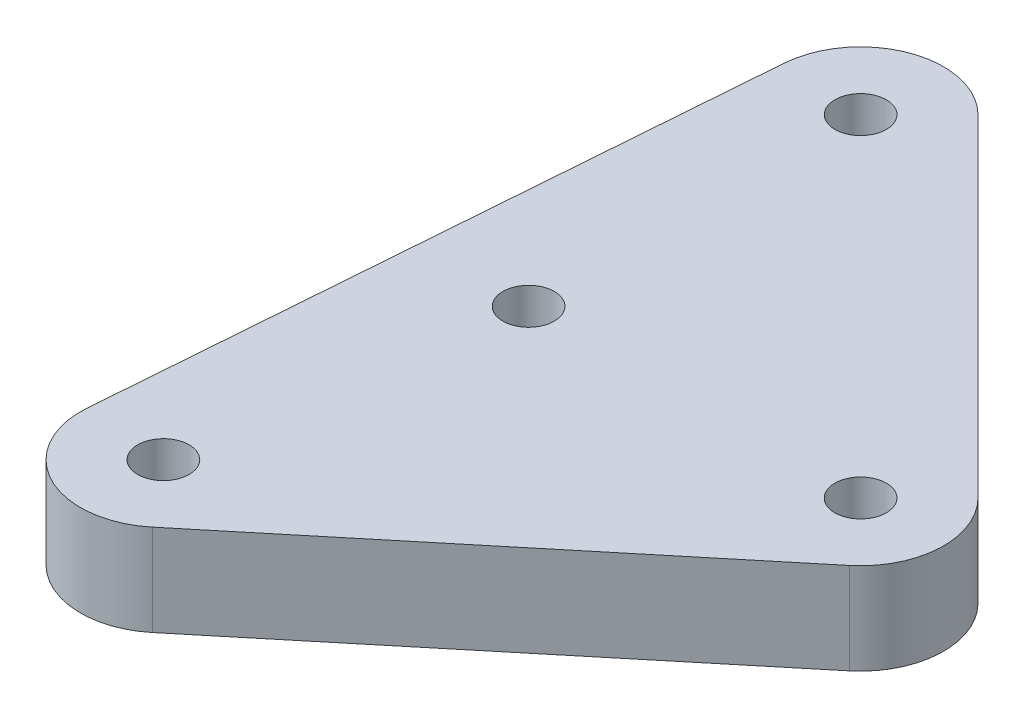
ISO-10303-21;
HEADER;
FILE_DESCRIPTION(('STEP AP214'),'2;1');
FILE_NAME('part.step','',(''),(''),'','','');
FILE_SCHEMA(('AUTOMOTIVE_DESIGN { 1 0 10303 214 1 1 1 1 }'));
ENDSEC;
DATA;
#1=APPLICATION_CONTEXT('core data for automotive mechanical design processes');
#2=APPLICATION_PROTOCOL_DEFINITION('international standard','automotive_design',2000,#1);
#3=PRODUCT_CONTEXT('',#1,'mechanical');
#4=PRODUCT('Part','Part','',(#3));
#5=PRODUCT_RELATED_PRODUCT_CATEGORY('part','',(#4));
#6=PRODUCT_DEFINITION_FORMATION('','',#4);
#7=PRODUCT_DEFINITION_CONTEXT('part definition',#1,'design');
#8=PRODUCT_DEFINITION('design','',#6,#7);
#9=PRODUCT_DEFINITION_SHAPE('','',#8);
#10=(LENGTH_UNIT() NAMED_UNIT(*) SI_UNIT(.MILLI.,.METRE.));
#11=(NAMED_UNIT(*) PLANE_ANGLE_UNIT() SI_UNIT($,.RADIAN.));
#12=(NAMED_UNIT(*) SI_UNIT($,.STERADIAN.) SOLID_ANGLE_UNIT());
#13=UNCERTAINTY_MEASURE_WITH_UNIT(LENGTH_MEASURE(1.E-05),#10,'distance_accuracy_value','');
#14=(GEOMETRIC_REPRESENTATION_CONTEXT(3) GLOBAL_UNCERTAINTY_ASSIGNED_CONTEXT((#13)) GLOBAL_UNIT_ASSIGNED_CONTEXT((#10,
#11,#12)) REPRESENTATION_CONTEXT('',''));
#15=CARTESIAN_POINT('',(0.,0.,0.));
#16=DIRECTION('',(0.,0.,1.));
#17=DIRECTION('',(1.,0.,0.));
#18=AXIS2_PLACEMENT_3D('',#15,#16,#17);
#19=CARTESIAN_POINT('',(20.,5.5,0.));
#20=DIRECTION('',(0.,-1.,0.));
#21=DIRECTION('',(0.,0.,-1.));
#22=AXIS2_PLACEMENT_3D('',#19,#20,#21);
#23=PLANE('',#22);
#24=CARTESIAN_POINT('',(20.,5.5,0.));
#25=DIRECTION('',(0.,1.,0.));
#26=DIRECTION('',(0.,0.,-1.));
#27=AXIS2_PLACEMENT_3D('',#24,#25,#26);
#28=CIRCLE('',#27,5.);
#29=CARTESIAN_POINT('',(23.1844072349815,5.5,3.85480875813544));
#30=VERTEX_POINT('',#29);
#31=CARTESIAN_POINT('',(23.5355339059327,5.5,-3.53553390593277));
#32=VERTEX_POINT('',#31);
#33=EDGE_CURVE('E129',#30,#32,#28,.T.);
#34=ORIENTED_EDGE('',*,*,#33,.T.);
#35=DIRECTION('',(-0.707106781186548,0.,-0.707106781186548));
#36=VECTOR('',#35,1.);
#37=CARTESIAN_POINT('',(3.53553390593277,5.5,-23.5355339059327));
#38=LINE('',#37,#36);
#39=CARTESIAN_POINT('',(3.53553390593277,5.5,-23.5355339059327));
#40=VERTEX_POINT('',#39);
#41=EDGE_CURVE('E87',#32,#40,#38,.T.);
#42=ORIENTED_EDGE('',*,*,#41,.T.);
#43=CARTESIAN_POINT('',(0.,5.5,-20.));
#44=DIRECTION('',(0.,1.,0.));
#45=DIRECTION('',(0.,0.,-1.));
#46=AXIS2_PLACEMENT_3D('',#43,#44,#45);
#47=CIRCLE('',#46,5.);
#48=CARTESIAN_POINT('',(-4.98527242750791,5.5,-20.3834824944237));
#49=VERTEX_POINT('',#48);
#50=EDGE_CURVE('E100',#40,#49,#47,.T.);
#51=ORIENTED_EDGE('',*,*,#50,.T.);
#52=DIRECTION('',(-0.0766964988847369,0.,0.997054485501581));
#53=VECTOR('',#52,1.);
#54=CARTESIAN_POINT('',(-7.9852724275079,5.5,18.6165175055763));
#55=LINE('',#54,#53);
#56=CARTESIAN_POINT('',(-7.9852724275079,5.5,18.6165175055763));
#57=VERTEX_POINT('',#56);
#58=EDGE_CURVE('E94',#49,#57,#55,.T.);
#59=ORIENTED_EDGE('',*,*,#58,.T.);
#60=CARTESIAN_POINT('',(-2.99999999999999,5.5,19.));
#61=DIRECTION('',(0.,1.,0.));
#62=DIRECTION('',(0.,0.,1.));
#63=AXIS2_PLACEMENT_3D('',#60,#61,#62);
#64=CIRCLE('',#63,5.);
#65=CARTESIAN_POINT('',(0.18440723498147,5.5,22.8548087581354));
#66=VERTEX_POINT('',#65);
#67=EDGE_CURVE('E98',#57,#66,#64,.T.);
#68=ORIENTED_EDGE('',*,*,#67,.T.);
#69=DIRECTION('',(0.77096175162709,0.,-0.636881446996291));
#70=VECTOR('',#69,1.);
#71=CARTESIAN_POINT('',(23.1844072349815,5.5,3.85480875813544));
#72=LINE('',#71,#70);
#73=EDGE_CURVE('E50',#66,#30,#72,.T.);
#74=ORIENTED_EDGE('',*,*,#73,.T.);
#75=EDGE_LOOP('',(#34,#42,#51,#59,#68,#74));
#76=FACE_BOUND('',#75,.T.);
#77=CARTESIAN_POINT('',(0.,5.5,-20.));
#78=DIRECTION('',(0.,1.,0.));
#79=DIRECTION('',(0.,0.,1.));
#80=AXIS2_PLACEMENT_3D('',#77,#78,#79);
#81=CIRCLE('',#80,1.55);
#82=CARTESIAN_POINT('',(0.,5.5,-18.45));
#83=VERTEX_POINT('',#82);
#84=EDGE_CURVE('E122',#83,#83,#81,.T.);
#85=ORIENTED_EDGE('',*,*,#84,.F.);
#86=EDGE_LOOP('',(#85));
#87=FACE_BOUND('',#86,.T.);
#88=CARTESIAN_POINT('',(0.,5.5,0.));
#89=DIRECTION('',(0.,1.,0.));
#90=DIRECTION('',(0.,0.,1.));
#91=AXIS2_PLACEMENT_3D('',#88,#89,#90);
#92=CIRCLE('',#91,1.55);
#93=CARTESIAN_POINT('',(0.,5.5,1.55));
#94=VERTEX_POINT('',#93);
#95=EDGE_CURVE('E193',#94,#94,#92,.T.);
#96=ORIENTED_EDGE('',*,*,#95,.F.);
#97=EDGE_LOOP('',(#96));
#98=FACE_BOUND('',#97,.T.);
#99=CARTESIAN_POINT('',(20.,5.5,0.));
#100=DIRECTION('',(0.,1.,0.));
#101=DIRECTION('',(0.,0.,1.));
#102=AXIS2_PLACEMENT_3D('',#99,#100,#101);
#103=CIRCLE('',#102,1.55);
#104=CARTESIAN_POINT('',(20.,5.5,1.55));
#105=VERTEX_POINT('',#104);
#106=EDGE_CURVE('E187',#105,#105,#103,.T.);
#107=ORIENTED_EDGE('',*,*,#106,.F.);
#108=EDGE_LOOP('',(#107));
#109=FACE_BOUND('',#108,.T.);
#110=CARTESIAN_POINT('',(-3.,5.5,19.));
#111=DIRECTION('',(0.,1.,0.));
#112=DIRECTION('',(0.,0.,1.));
#113=AXIS2_PLACEMENT_3D('',#110,#111,#112);
#114=CIRCLE('',#113,1.55);
#115=CARTESIAN_POINT('',(-3.,5.5,20.55));
#116=VERTEX_POINT('',#115);
#117=EDGE_CURVE('E178',#116,#116,#114,.T.);
#118=ORIENTED_EDGE('',*,*,#117,.F.);
#119=EDGE_LOOP('',(#118));
#120=FACE_BOUND('',#119,.T.);
#121=ADVANCED_FACE('F33',(#76,#87,#98,#109,#120),#23,.F.);
#122=CARTESIAN_POINT('',(20.,0.,0.));
#123=DIRECTION('',(0.,-1.,0.));
#124=DIRECTION('',(0.,0.,-1.));
#125=AXIS2_PLACEMENT_3D('',#122,#123,#124);
#126=PLANE('',#125);
#127=CARTESIAN_POINT('',(20.,0.,0.));
#128=DIRECTION('',(0.,1.,0.));
#129=DIRECTION('',(0.,0.,1.));
#130=AXIS2_PLACEMENT_3D('',#127,#128,#129);
#131=CIRCLE('',#130,1.55);
#132=CARTESIAN_POINT('',(20.,0.,1.55));
#133=VERTEX_POINT('',#132);
#134=EDGE_CURVE('E184',#133,#133,#131,.T.);
#135=ORIENTED_EDGE('',*,*,#134,.T.);
#136=EDGE_LOOP('',(#135));
#137=FACE_BOUND('',#136,.T.);
#138=CARTESIAN_POINT('',(0.,0.,-20.));
#139=DIRECTION('',(0.,1.,0.));
#140=DIRECTION('',(0.,0.,1.));
#141=AXIS2_PLACEMENT_3D('',#138,#139,#140);
#142=CIRCLE('',#141,1.55);
#143=CARTESIAN_POINT('',(0.,0.,-18.45));
#144=VERTEX_POINT('',#143);
#145=EDGE_CURVE('E196',#144,#144,#142,.T.);
#146=ORIENTED_EDGE('',*,*,#145,.T.);
#147=EDGE_LOOP('',(#146));
#148=FACE_BOUND('',#147,.T.);
#149=CARTESIAN_POINT('',(20.,0.,0.));
#150=DIRECTION('',(0.,1.,0.));
#151=DIRECTION('',(0.,0.,-1.));
#152=AXIS2_PLACEMENT_3D('',#149,#150,#151);
#153=CIRCLE('',#152,5.);
#154=CARTESIAN_POINT('',(23.1844072349815,0.,3.85480875813544));
#155=VERTEX_POINT('',#154);
#156=CARTESIAN_POINT('',(23.5355339059327,0.,-3.53553390593277));
#157=VERTEX_POINT('',#156);
#158=EDGE_CURVE('E118',#155,#157,#153,.T.);
#159=ORIENTED_EDGE('',*,*,#158,.F.);
#160=DIRECTION('',(0.77096175162709,0.,-0.636881446996291));
#161=VECTOR('',#160,1.);
#162=CARTESIAN_POINT('',(23.1844072349815,0.,3.85480875813544));
#163=LINE('',#162,#161);
#164=CARTESIAN_POINT('',(0.18440723498147,0.,22.8548087581354));
#165=VERTEX_POINT('',#164);
#166=EDGE_CURVE('E79',#165,#155,#163,.T.);
#167=ORIENTED_EDGE('',*,*,#166,.F.);
#168=CARTESIAN_POINT('',(-2.99999999999999,0.,19.));
#169=DIRECTION('',(0.,1.,0.));
#170=DIRECTION('',(0.,0.,1.));
#171=AXIS2_PLACEMENT_3D('',#168,#169,#170);
#172=CIRCLE('',#171,5.);
#173=CARTESIAN_POINT('',(-7.9852724275079,0.,18.6165175055763));
#174=VERTEX_POINT('',#173);
#175=EDGE_CURVE('E73',#174,#165,#172,.T.);
#176=ORIENTED_EDGE('',*,*,#175,.F.);
#177=DIRECTION('',(-0.0766964988847369,0.,0.997054485501581));
#178=VECTOR('',#177,1.);
#179=CARTESIAN_POINT('',(-7.9852724275079,0.,18.6165175055763));
#180=LINE('',#179,#178);
#181=CARTESIAN_POINT('',(-4.98527242750791,0.,-20.3834824944237));
#182=VERTEX_POINT('',#181);
#183=EDGE_CURVE('E108',#182,#174,#180,.T.);
#184=ORIENTED_EDGE('',*,*,#183,.F.);
#185=CARTESIAN_POINT('',(0.,0.,-20.));
#186=DIRECTION('',(0.,1.,0.));
#187=DIRECTION('',(0.,0.,-1.));
#188=AXIS2_PLACEMENT_3D('',#185,#186,#187);
#189=CIRCLE('',#188,5.);
#190=CARTESIAN_POINT('',(3.53553390593277,0.,-23.5355339059327));
#191=VERTEX_POINT('',#190);
#192=EDGE_CURVE('E124',#191,#182,#189,.T.);
#193=ORIENTED_EDGE('',*,*,#192,.F.);
#194=DIRECTION('',(-0.707106781186548,0.,-0.707106781186548));
#195=VECTOR('',#194,1.);
#196=CARTESIAN_POINT('',(3.53553390593277,0.,-23.5355339059327));
#197=LINE('',#196,#195);
#198=EDGE_CURVE('E121',#157,#191,#197,.T.);
#199=ORIENTED_EDGE('',*,*,#198,.F.);
#200=EDGE_LOOP('',(#159,#167,#176,#184,#193,#199));
#201=FACE_BOUND('',#200,.T.);
#202=CARTESIAN_POINT('',(0.,0.,0.));
#203=DIRECTION('',(0.,1.,0.));
#204=DIRECTION('',(0.,0.,1.));
#205=AXIS2_PLACEMENT_3D('',#202,#203,#204);
#206=CIRCLE('',#205,1.55);
#207=CARTESIAN_POINT('',(0.,0.,1.55));
#208=VERTEX_POINT('',#207);
#209=EDGE_CURVE('E190',#208,#208,#206,.T.);
#210=ORIENTED_EDGE('',*,*,#209,.T.);
#211=EDGE_LOOP('',(#210));
#212=FACE_BOUND('',#211,.T.);
#213=CARTESIAN_POINT('',(-3.,0.,19.));
#214=DIRECTION('',(0.,1.,0.));
#215=DIRECTION('',(0.,0.,1.));
#216=AXIS2_PLACEMENT_3D('',#213,#214,#215);
#217=CIRCLE('',#216,1.55);
#218=CARTESIAN_POINT('',(-3.,0.,20.55));
#219=VERTEX_POINT('',#218);
#220=EDGE_CURVE('E181',#219,#219,#217,.T.);
#221=ORIENTED_EDGE('',*,*,#220,.T.);
#222=EDGE_LOOP('',(#221));
#223=FACE_BOUND('',#222,.T.);
#224=ADVANCED_FACE('F138',(#137,#148,#201,#212,#223),#126,.T.);
#225=CARTESIAN_POINT('',(20.,5.5,0.));
#226=DIRECTION('',(0.,-1.,0.));
#227=DIRECTION('',(0.,0.,-1.));
#228=AXIS2_PLACEMENT_3D('',#225,#226,#227);
#229=CYLINDRICAL_SURFACE('',#228,5.);
#230=ORIENTED_EDGE('',*,*,#158,.T.);
#231=DIRECTION('',(0.,-1.,0.));
#232=VECTOR('',#231,1.);
#233=CARTESIAN_POINT('',(23.5355339059327,5.5,-3.53553390593277));
#234=LINE('',#233,#232);
#235=EDGE_CURVE('E11',#32,#157,#234,.T.);
#236=ORIENTED_EDGE('',*,*,#235,.F.);
#237=ORIENTED_EDGE('',*,*,#33,.F.);
#238=DIRECTION('',(0.,-1.,0.));
#239=VECTOR('',#238,1.);
#240=CARTESIAN_POINT('',(23.1844072349815,5.5,3.85480875813544));
#241=LINE('',#240,#239);
#242=EDGE_CURVE('E114',#30,#155,#241,.T.);
#243=ORIENTED_EDGE('',*,*,#242,.T.);
#244=EDGE_LOOP('',(#230,#236,#237,#243));
#245=FACE_BOUND('',#244,.T.);
#246=ADVANCED_FACE('F35',(#245),#229,.T.);
#247=CARTESIAN_POINT('',(3.53553390593277,5.5,-23.5355339059327));
#248=DIRECTION('',(-0.707106781186548,0.,0.707106781186548));
#249=DIRECTION('',(0.707106781186548,0.,0.707106781186548));
#250=AXIS2_PLACEMENT_3D('',#247,#248,#249);
#251=PLANE('',#250);
#252=ORIENTED_EDGE('',*,*,#198,.T.);
#253=DIRECTION('',(0.,-1.,0.));
#254=VECTOR('',#253,1.);
#255=CARTESIAN_POINT('',(3.53553390593277,5.5,-23.5355339059327));
#256=LINE('',#255,#254);
#257=EDGE_CURVE('E42',#40,#191,#256,.T.);
#258=ORIENTED_EDGE('',*,*,#257,.F.);
#259=ORIENTED_EDGE('',*,*,#41,.F.);
#260=ORIENTED_EDGE('',*,*,#235,.T.);
#261=EDGE_LOOP('',(#252,#258,#259,#260));
#262=FACE_BOUND('',#261,.T.);
#263=ADVANCED_FACE('F256',(#262),#251,.F.);
#264=CARTESIAN_POINT('',(0.,5.5,-20.));
#265=DIRECTION('',(0.,-1.,0.));
#266=DIRECTION('',(0.,0.,-1.));
#267=AXIS2_PLACEMENT_3D('',#264,#265,#266);
#268=CYLINDRICAL_SURFACE('',#267,5.);
#269=ORIENTED_EDGE('',*,*,#192,.T.);
#270=DIRECTION('',(0.,-1.,0.));
#271=VECTOR('',#270,1.);
#272=CARTESIAN_POINT('',(-4.98527242750791,5.5,-20.3834824944237));
#273=LINE('',#272,#271);
#274=EDGE_CURVE('E109',#49,#182,#273,.T.);
#275=ORIENTED_EDGE('',*,*,#274,.F.);
#276=ORIENTED_EDGE('',*,*,#50,.F.);
#277=ORIENTED_EDGE('',*,*,#257,.T.);
#278=EDGE_LOOP('',(#269,#275,#276,#277));
#279=FACE_BOUND('',#278,.T.);
#280=ADVANCED_FACE('F135',(#279),#268,.T.);
#281=CARTESIAN_POINT('',(-7.9852724275079,5.5,18.6165175055763));
#282=DIRECTION('',(0.997054485501582,0.,0.076696498884737));
#283=DIRECTION('',(0.076696498884737,0.,-0.997054485501582));
#284=AXIS2_PLACEMENT_3D('',#281,#282,#283);
#285=PLANE('',#284);
#286=ORIENTED_EDGE('',*,*,#183,.T.);
#287=DIRECTION('',(0.,-1.,0.));
#288=VECTOR('',#287,1.);
#289=CARTESIAN_POINT('',(-7.9852724275079,5.5,18.6165175055763));
#290=LINE('',#289,#288);
#291=EDGE_CURVE('E105',#57,#174,#290,.T.);
#292=ORIENTED_EDGE('',*,*,#291,.F.);
#293=ORIENTED_EDGE('',*,*,#58,.F.);
#294=ORIENTED_EDGE('',*,*,#274,.T.);
#295=EDGE_LOOP('',(#286,#292,#293,#294));
#296=FACE_BOUND('',#295,.T.);
#297=ADVANCED_FACE('F106',(#296),#285,.F.);
#298=CARTESIAN_POINT('',(-2.99999999999999,5.5,19.));
#299=DIRECTION('',(0.,-1.,0.));
#300=DIRECTION('',(0.,0.,-1.));
#301=AXIS2_PLACEMENT_3D('',#298,#299,#300);
#302=CYLINDRICAL_SURFACE('',#301,5.);
#303=ORIENTED_EDGE('',*,*,#175,.T.);
#304=DIRECTION('',(0.,-1.,0.));
#305=VECTOR('',#304,1.);
#306=CARTESIAN_POINT('',(0.18440723498147,5.5,22.8548087581354));
#307=LINE('',#306,#305);
#308=EDGE_CURVE('E110',#66,#165,#307,.T.);
#309=ORIENTED_EDGE('',*,*,#308,.F.);
#310=ORIENTED_EDGE('',*,*,#67,.F.);
#311=ORIENTED_EDGE('',*,*,#291,.T.);
#312=EDGE_LOOP('',(#303,#309,#310,#311));
#313=FACE_BOUND('',#312,.T.);
#314=ADVANCED_FACE('F112',(#313),#302,.T.);
#315=CARTESIAN_POINT('',(23.1844072349815,5.5,3.85480875813544));
#316=DIRECTION('',(-0.636881446996291,0.,-0.77096175162709));
#317=DIRECTION('',(-0.77096175162709,0.,0.636881446996291));
#318=AXIS2_PLACEMENT_3D('',#315,#316,#317);
#319=PLANE('',#318);
#320=ORIENTED_EDGE('',*,*,#166,.T.);
#321=ORIENTED_EDGE('',*,*,#242,.F.);
#322=ORIENTED_EDGE('',*,*,#73,.F.);
#323=ORIENTED_EDGE('',*,*,#308,.T.);
#324=EDGE_LOOP('',(#320,#321,#322,#323));
#325=FACE_BOUND('',#324,.T.);
#326=ADVANCED_FACE('F143',(#325),#319,.F.);
#327=CARTESIAN_POINT('',(0.,5.5,-20.));
#328=DIRECTION('',(0.,-1.,0.));
#329=DIRECTION('',(0.,0.,-1.));
#330=AXIS2_PLACEMENT_3D('',#327,#328,#329);
#331=CYLINDRICAL_SURFACE('',#330,1.55);
#332=ORIENTED_EDGE('',*,*,#84,.T.);
#333=EDGE_LOOP('',(#332));
#334=FACE_BOUND('',#333,.T.);
#335=ORIENTED_EDGE('',*,*,#145,.F.);
#336=EDGE_LOOP('',(#335));
#337=FACE_BOUND('',#336,.T.);
#338=ADVANCED_FACE('F145',(#334,#337),#331,.F.);
#339=CARTESIAN_POINT('',(0.,5.5,0.));
#340=DIRECTION('',(0.,-1.,0.));
#341=DIRECTION('',(0.,0.,-1.));
#342=AXIS2_PLACEMENT_3D('',#339,#340,#341);
#343=CYLINDRICAL_SURFACE('',#342,1.55);
#344=ORIENTED_EDGE('',*,*,#95,.T.);
#345=EDGE_LOOP('',(#344));
#346=FACE_BOUND('',#345,.T.);
#347=ORIENTED_EDGE('',*,*,#209,.F.);
#348=EDGE_LOOP('',(#347));
#349=FACE_BOUND('',#348,.T.);
#350=ADVANCED_FACE('F151',(#346,#349),#343,.F.);
#351=CARTESIAN_POINT('',(20.,5.5,0.));
#352=DIRECTION('',(0.,-1.,0.));
#353=DIRECTION('',(0.,0.,-1.));
#354=AXIS2_PLACEMENT_3D('',#351,#352,#353);
#355=CYLINDRICAL_SURFACE('',#354,1.55);
#356=ORIENTED_EDGE('',*,*,#106,.T.);
#357=EDGE_LOOP('',(#356));
#358=FACE_BOUND('',#357,.T.);
#359=ORIENTED_EDGE('',*,*,#134,.F.);
#360=EDGE_LOOP('',(#359));
#361=FACE_BOUND('',#360,.T.);
#362=ADVANCED_FACE('F165',(#358,#361),#355,.F.);
#363=CARTESIAN_POINT('',(-3.,5.5,19.));
#364=DIRECTION('',(0.,-1.,0.));
#365=DIRECTION('',(0.,0.,-1.));
#366=AXIS2_PLACEMENT_3D('',#363,#364,#365);
#367=CYLINDRICAL_SURFACE('',#366,1.55);
#368=ORIENTED_EDGE('',*,*,#117,.T.);
#369=EDGE_LOOP('',(#368));
#370=FACE_BOUND('',#369,.T.);
#371=ORIENTED_EDGE('',*,*,#220,.F.);
#372=EDGE_LOOP('',(#371));
#373=FACE_BOUND('',#372,.T.);
#374=ADVANCED_FACE('F169',(#370,#373),#367,.F.);
#375=CLOSED_SHELL('',(#121,#224,#246,#263,#280,#297,#314,#326,#338,#350,#362,#374));
#376=MANIFOLD_SOLID_BREP('B2',#375);
#377=ADVANCED_BREP_SHAPE_REPRESENTATION('',(#18,#376),#14);
#378=SHAPE_DEFINITION_REPRESENTATION(#9,#377);
ENDSEC;
END-ISO-10303-21;
